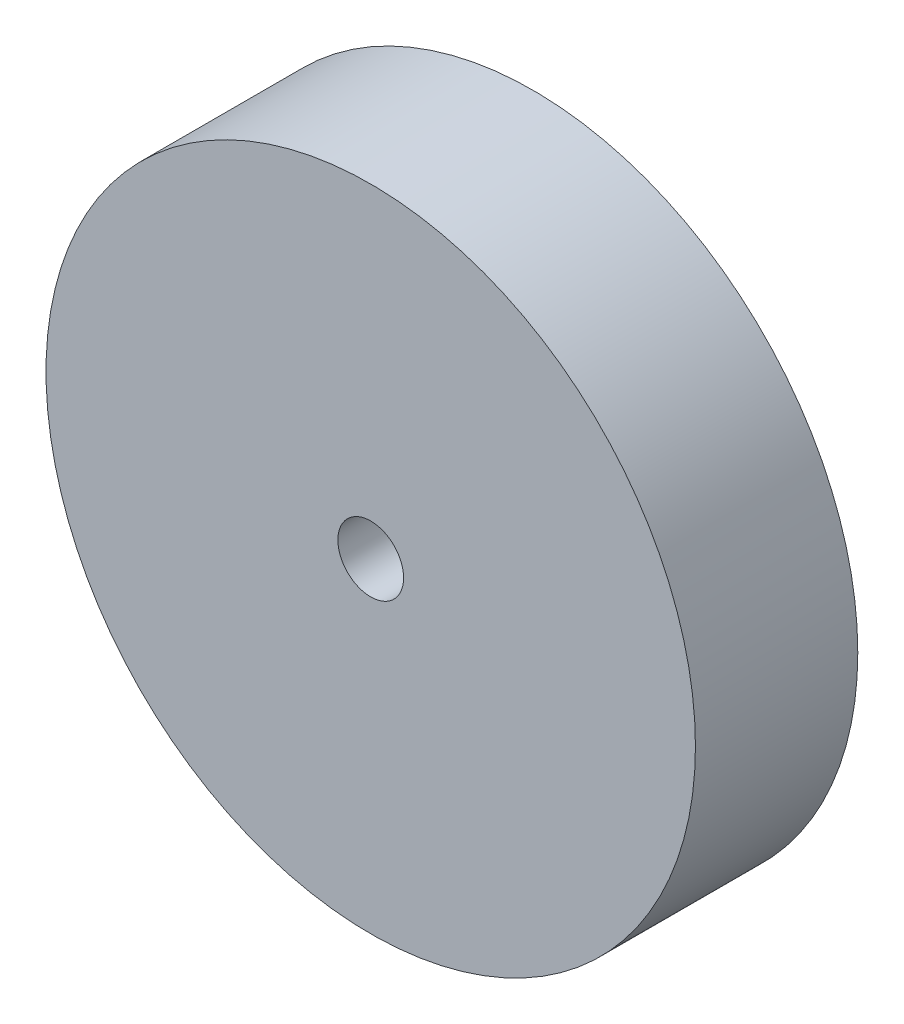
ISO-10303-21;
HEADER;
FILE_DESCRIPTION(('STEP AP214'),'2;1');
FILE_NAME('part.step','',(''),(''),'','','');
FILE_SCHEMA(('AUTOMOTIVE_DESIGN { 1 0 10303 214 1 1 1 1 }'));
ENDSEC;
DATA;
#1=APPLICATION_CONTEXT('core data for automotive mechanical design processes');
#2=APPLICATION_PROTOCOL_DEFINITION('international standard','automotive_design',2000,#1);
#3=PRODUCT_CONTEXT('',#1,'mechanical');
#4=PRODUCT('Part','Part','',(#3));
#5=PRODUCT_RELATED_PRODUCT_CATEGORY('part','',(#4));
#6=PRODUCT_DEFINITION_FORMATION('','',#4);
#7=PRODUCT_DEFINITION_CONTEXT('part definition',#1,'design');
#8=PRODUCT_DEFINITION('design','',#6,#7);
#9=PRODUCT_DEFINITION_SHAPE('','',#8);
#10=(LENGTH_UNIT() NAMED_UNIT(*) SI_UNIT(.MILLI.,.METRE.));
#11=(NAMED_UNIT(*) PLANE_ANGLE_UNIT() SI_UNIT($,.RADIAN.));
#12=(NAMED_UNIT(*) SI_UNIT($,.STERADIAN.) SOLID_ANGLE_UNIT());
#13=UNCERTAINTY_MEASURE_WITH_UNIT(LENGTH_MEASURE(1.E-05),#10,'distance_accuracy_value','');
#14=(GEOMETRIC_REPRESENTATION_CONTEXT(3) GLOBAL_UNCERTAINTY_ASSIGNED_CONTEXT((#13)) GLOBAL_UNIT_ASSIGNED_CONTEXT((#10,
#11,#12)) REPRESENTATION_CONTEXT('',''));
#15=CARTESIAN_POINT('',(0.,0.,0.));
#16=DIRECTION('',(0.,0.,1.));
#17=DIRECTION('',(1.,0.,0.));
#18=AXIS2_PLACEMENT_3D('',#15,#16,#17);
#19=CARTESIAN_POINT('',(0.,0.,10.));
#20=DIRECTION('',(0.,0.,-1.));
#21=DIRECTION('',(-1.,0.,0.));
#22=AXIS2_PLACEMENT_3D('',#19,#20,#21);
#23=CYLINDRICAL_SURFACE('',#22,40.);
#24=CARTESIAN_POINT('',(0.,0.,10.));
#25=DIRECTION('',(0.,0.,1.));
#26=DIRECTION('',(1.,0.,0.));
#27=AXIS2_PLACEMENT_3D('',#24,#25,#26);
#28=CIRCLE('',#27,40.);
#29=CARTESIAN_POINT('',(40.,0.,10.));
#30=VERTEX_POINT('',#29);
#31=EDGE_CURVE('E10',#30,#30,#28,.T.);
#32=ORIENTED_EDGE('',*,*,#31,.F.);
#33=EDGE_LOOP('',(#32));
#34=FACE_BOUND('',#33,.T.);
#35=CARTESIAN_POINT('',(0.,0.,-10.));
#36=DIRECTION('',(0.,0.,1.));
#37=DIRECTION('',(1.,0.,0.));
#38=AXIS2_PLACEMENT_3D('',#35,#36,#37);
#39=CIRCLE('',#38,40.);
#40=CARTESIAN_POINT('',(40.,0.,-10.));
#41=VERTEX_POINT('',#40);
#42=EDGE_CURVE('E38',#41,#41,#39,.T.);
#43=ORIENTED_EDGE('',*,*,#42,.T.);
#44=EDGE_LOOP('',(#43));
#45=FACE_BOUND('',#44,.T.);
#46=ADVANCED_FACE('F31',(#34,#45),#23,.T.);
#47=CARTESIAN_POINT('',(0.,0.,10.));
#48=DIRECTION('',(0.,0.,1.));
#49=DIRECTION('',(1.,0.,0.));
#50=AXIS2_PLACEMENT_3D('',#47,#48,#49);
#51=PLANE('',#50);
#52=CARTESIAN_POINT('',(0.,0.,10.));
#53=DIRECTION('',(0.,0.,1.));
#54=DIRECTION('',(1.,0.,0.));
#55=AXIS2_PLACEMENT_3D('',#52,#53,#54);
#56=CIRCLE('',#55,4.05);
#57=CARTESIAN_POINT('',(4.05,0.,10.));
#58=VERTEX_POINT('',#57);
#59=EDGE_CURVE('E43',#58,#58,#56,.F.);
#60=ORIENTED_EDGE('',*,*,#59,.T.);
#61=EDGE_LOOP('',(#60));
#62=FACE_BOUND('',#61,.T.);
#63=ORIENTED_EDGE('',*,*,#31,.T.);
#64=EDGE_LOOP('',(#63));
#65=FACE_BOUND('',#64,.T.);
#66=ADVANCED_FACE('F56',(#62,#65),#51,.T.);
#67=CARTESIAN_POINT('',(0.,0.,-10.));
#68=DIRECTION('',(0.,0.,1.));
#69=DIRECTION('',(1.,0.,0.));
#70=AXIS2_PLACEMENT_3D('',#67,#68,#69);
#71=PLANE('',#70);
#72=CARTESIAN_POINT('',(0.,0.,-10.));
#73=DIRECTION('',(0.,0.,1.));
#74=DIRECTION('',(1.,0.,0.));
#75=AXIS2_PLACEMENT_3D('',#72,#73,#74);
#76=CIRCLE('',#75,4.05);
#77=CARTESIAN_POINT('',(4.05,0.,-10.));
#78=VERTEX_POINT('',#77);
#79=EDGE_CURVE('E34',#78,#78,#76,.F.);
#80=ORIENTED_EDGE('',*,*,#79,.F.);
#81=EDGE_LOOP('',(#80));
#82=FACE_BOUND('',#81,.T.);
#83=ORIENTED_EDGE('',*,*,#42,.F.);
#84=EDGE_LOOP('',(#83));
#85=FACE_BOUND('',#84,.T.);
#86=ADVANCED_FACE('F53',(#82,#85),#71,.F.);
#87=CARTESIAN_POINT('',(0.,0.,35.));
#88=DIRECTION('',(0.,0.,-1.));
#89=DIRECTION('',(-1.,0.,0.));
#90=AXIS2_PLACEMENT_3D('',#87,#88,#89);
#91=CYLINDRICAL_SURFACE('',#90,4.05);
#92=ORIENTED_EDGE('',*,*,#59,.F.);
#93=EDGE_LOOP('',(#92));
#94=FACE_BOUND('',#93,.T.);
#95=ORIENTED_EDGE('',*,*,#79,.T.);
#96=EDGE_LOOP('',(#95));
#97=FACE_BOUND('',#96,.T.);
#98=ADVANCED_FACE('F51',(#94,#97),#91,.F.);
#99=CLOSED_SHELL('',(#46,#66,#86,#98));
#100=MANIFOLD_SOLID_BREP('B2',#99);
#101=ADVANCED_BREP_SHAPE_REPRESENTATION('',(#18,#100),#14);
#102=SHAPE_DEFINITION_REPRESENTATION(#9,#101);
ENDSEC;
END-ISO-10303-21;
